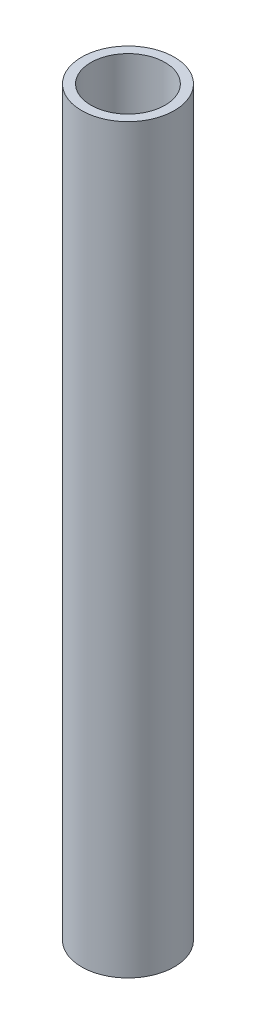
ISO-10303-21;
HEADER;
FILE_DESCRIPTION(('STEP AP214'),'2;1');
FILE_NAME('part.step','',(''),(''),'','','');
FILE_SCHEMA(('AUTOMOTIVE_DESIGN { 1 0 10303 214 1 1 1 1 }'));
ENDSEC;
DATA;
#1=APPLICATION_CONTEXT('core data for automotive mechanical design processes');
#2=APPLICATION_PROTOCOL_DEFINITION('international standard','automotive_design',2000,#1);
#3=PRODUCT_CONTEXT('',#1,'mechanical');
#4=PRODUCT('Part','Part','',(#3));
#5=PRODUCT_RELATED_PRODUCT_CATEGORY('part','',(#4));
#6=PRODUCT_DEFINITION_FORMATION('','',#4);
#7=PRODUCT_DEFINITION_CONTEXT('part definition',#1,'design');
#8=PRODUCT_DEFINITION('design','',#6,#7);
#9=PRODUCT_DEFINITION_SHAPE('','',#8);
#10=(LENGTH_UNIT() NAMED_UNIT(*) SI_UNIT(.MILLI.,.METRE.));
#11=(NAMED_UNIT(*) PLANE_ANGLE_UNIT() SI_UNIT($,.RADIAN.));
#12=(NAMED_UNIT(*) SI_UNIT($,.STERADIAN.) SOLID_ANGLE_UNIT());
#13=UNCERTAINTY_MEASURE_WITH_UNIT(LENGTH_MEASURE(1.E-05),#10,'distance_accuracy_value','');
#14=(GEOMETRIC_REPRESENTATION_CONTEXT(3) GLOBAL_UNCERTAINTY_ASSIGNED_CONTEXT((#13)) GLOBAL_UNIT_ASSIGNED_CONTEXT((#10,
#11,#12)) REPRESENTATION_CONTEXT('',''));
#15=CARTESIAN_POINT('',(0.,0.,0.));
#16=DIRECTION('',(0.,0.,1.));
#17=DIRECTION('',(1.,0.,0.));
#18=AXIS2_PLACEMENT_3D('',#15,#16,#17);
#19=CARTESIAN_POINT('',(0.,127.,0.));
#20=DIRECTION('',(0.,1.,0.));
#21=DIRECTION('',(0.,0.,1.));
#22=AXIS2_PLACEMENT_3D('',#19,#20,#21);
#23=PLANE('',#22);
#24=CARTESIAN_POINT('',(0.,127.,0.));
#25=DIRECTION('',(0.,1.,0.));
#26=DIRECTION('',(0.,0.,1.));
#27=AXIS2_PLACEMENT_3D('',#24,#25,#26);
#28=CIRCLE('',#27,15.875);
#29=CARTESIAN_POINT('',(0.,127.,15.875));
#30=VERTEX_POINT('',#29);
#31=EDGE_CURVE('E10',#30,#30,#28,.T.);
#32=ORIENTED_EDGE('',*,*,#31,.T.);
#33=EDGE_LOOP('',(#32));
#34=FACE_BOUND('',#33,.T.);
#35=CARTESIAN_POINT('',(0.,127.,0.));
#36=DIRECTION('',(0.,1.,0.));
#37=DIRECTION('',(0.,0.,1.));
#38=AXIS2_PLACEMENT_3D('',#35,#36,#37);
#39=CIRCLE('',#38,12.7);
#40=CARTESIAN_POINT('',(0.,127.,12.7));
#41=VERTEX_POINT('',#40);
#42=EDGE_CURVE('E42',#41,#41,#39,.T.);
#43=ORIENTED_EDGE('',*,*,#42,.F.);
#44=EDGE_LOOP('',(#43));
#45=FACE_BOUND('',#44,.T.);
#46=ADVANCED_FACE('F31',(#34,#45),#23,.T.);
#47=CARTESIAN_POINT('',(0.,-127.,0.));
#48=DIRECTION('',(0.,1.,0.));
#49=DIRECTION('',(0.,0.,1.));
#50=AXIS2_PLACEMENT_3D('',#47,#48,#49);
#51=PLANE('',#50);
#52=CARTESIAN_POINT('',(0.,-127.,0.));
#53=DIRECTION('',(0.,1.,0.));
#54=DIRECTION('',(0.,0.,1.));
#55=AXIS2_PLACEMENT_3D('',#52,#53,#54);
#56=CIRCLE('',#55,15.875);
#57=CARTESIAN_POINT('',(0.,-127.,15.875));
#58=VERTEX_POINT('',#57);
#59=EDGE_CURVE('E35',#58,#58,#56,.T.);
#60=ORIENTED_EDGE('',*,*,#59,.F.);
#61=EDGE_LOOP('',(#60));
#62=FACE_BOUND('',#61,.T.);
#63=CARTESIAN_POINT('',(0.,-127.,0.));
#64=DIRECTION('',(0.,1.,0.));
#65=DIRECTION('',(0.,0.,1.));
#66=AXIS2_PLACEMENT_3D('',#63,#64,#65);
#67=CIRCLE('',#66,12.7);
#68=CARTESIAN_POINT('',(0.,-127.,12.7));
#69=VERTEX_POINT('',#68);
#70=EDGE_CURVE('E44',#69,#69,#67,.T.);
#71=ORIENTED_EDGE('',*,*,#70,.T.);
#72=EDGE_LOOP('',(#71));
#73=FACE_BOUND('',#72,.T.);
#74=ADVANCED_FACE('F54',(#62,#73),#51,.F.);
#75=CARTESIAN_POINT('',(0.,127.,0.));
#76=DIRECTION('',(0.,-1.,0.));
#77=DIRECTION('',(0.,0.,-1.));
#78=AXIS2_PLACEMENT_3D('',#75,#76,#77);
#79=CYLINDRICAL_SURFACE('',#78,15.875);
#80=ORIENTED_EDGE('',*,*,#31,.F.);
#81=EDGE_LOOP('',(#80));
#82=FACE_BOUND('',#81,.T.);
#83=ORIENTED_EDGE('',*,*,#59,.T.);
#84=EDGE_LOOP('',(#83));
#85=FACE_BOUND('',#84,.T.);
#86=ADVANCED_FACE('F33',(#82,#85),#79,.T.);
#87=CARTESIAN_POINT('',(0.,127.,0.));
#88=DIRECTION('',(0.,-1.,0.));
#89=DIRECTION('',(0.,0.,-1.));
#90=AXIS2_PLACEMENT_3D('',#87,#88,#89);
#91=CYLINDRICAL_SURFACE('',#90,12.7);
#92=ORIENTED_EDGE('',*,*,#42,.T.);
#93=EDGE_LOOP('',(#92));
#94=FACE_BOUND('',#93,.T.);
#95=ORIENTED_EDGE('',*,*,#70,.F.);
#96=EDGE_LOOP('',(#95));
#97=FACE_BOUND('',#96,.T.);
#98=ADVANCED_FACE('F50',(#94,#97),#91,.F.);
#99=CLOSED_SHELL('',(#46,#74,#86,#98));
#100=MANIFOLD_SOLID_BREP('B2',#99);
#101=ADVANCED_BREP_SHAPE_REPRESENTATION('',(#18,#100),#14);
#102=SHAPE_DEFINITION_REPRESENTATION(#9,#101);
ENDSEC;
END-ISO-10303-21;
